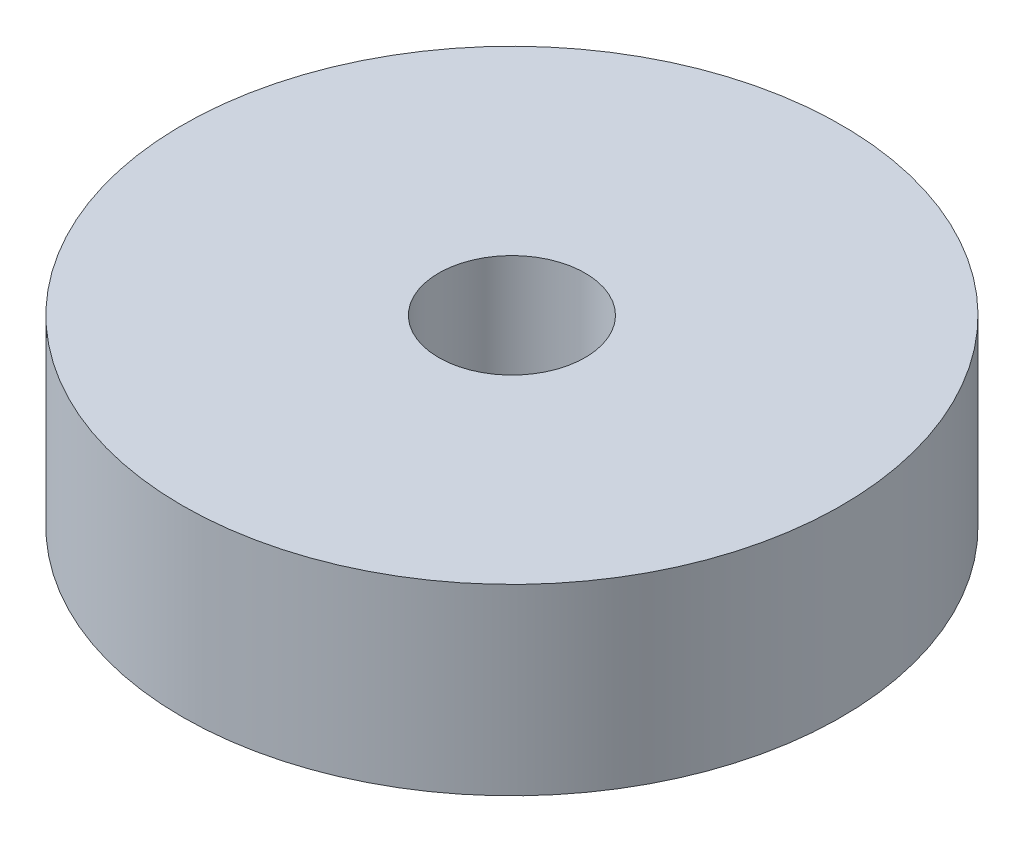
ISO-10303-21;
HEADER;
FILE_DESCRIPTION(('STEP AP214'),'2;1');
FILE_NAME('part.step','',(''),(''),'','','');
FILE_SCHEMA(('AUTOMOTIVE_DESIGN { 1 0 10303 214 1 1 1 1 }'));
ENDSEC;
DATA;
#1=APPLICATION_CONTEXT('core data for automotive mechanical design processes');
#2=APPLICATION_PROTOCOL_DEFINITION('international standard','automotive_design',2000,#1);
#3=PRODUCT_CONTEXT('',#1,'mechanical');
#4=PRODUCT('Part','Part','',(#3));
#5=PRODUCT_RELATED_PRODUCT_CATEGORY('part','',(#4));
#6=PRODUCT_DEFINITION_FORMATION('','',#4);
#7=PRODUCT_DEFINITION_CONTEXT('part definition',#1,'design');
#8=PRODUCT_DEFINITION('design','',#6,#7);
#9=PRODUCT_DEFINITION_SHAPE('','',#8);
#10=(LENGTH_UNIT() NAMED_UNIT(*) SI_UNIT(.MILLI.,.METRE.));
#11=(NAMED_UNIT(*) PLANE_ANGLE_UNIT() SI_UNIT($,.RADIAN.));
#12=(NAMED_UNIT(*) SI_UNIT($,.STERADIAN.) SOLID_ANGLE_UNIT());
#13=UNCERTAINTY_MEASURE_WITH_UNIT(LENGTH_MEASURE(1.E-05),#10,'distance_accuracy_value','');
#14=(GEOMETRIC_REPRESENTATION_CONTEXT(3) GLOBAL_UNCERTAINTY_ASSIGNED_CONTEXT((#13)) GLOBAL_UNIT_ASSIGNED_CONTEXT((#10,
#11,#12)) REPRESENTATION_CONTEXT('',''));
#15=CARTESIAN_POINT('',(0.,0.,0.));
#16=DIRECTION('',(0.,0.,1.));
#17=DIRECTION('',(1.,0.,0.));
#18=AXIS2_PLACEMENT_3D('',#15,#16,#17);
#19=CARTESIAN_POINT('',(0.,7.9375,0.));
#20=DIRECTION('',(0.,1.,0.));
#21=DIRECTION('',(0.,0.,1.));
#22=AXIS2_PLACEMENT_3D('',#19,#20,#21);
#23=PLANE('',#22);
#24=CARTESIAN_POINT('',(0.,7.9375,0.));
#25=DIRECTION('',(0.,1.,0.));
#26=DIRECTION('',(0.,0.,1.));
#27=AXIS2_PLACEMENT_3D('',#24,#25,#26);
#28=CIRCLE('',#27,14.2875);
#29=CARTESIAN_POINT('',(0.,7.9375,14.2875));
#30=VERTEX_POINT('',#29);
#31=EDGE_CURVE('E10',#30,#30,#28,.T.);
#32=ORIENTED_EDGE('',*,*,#31,.T.);
#33=EDGE_LOOP('',(#32));
#34=FACE_BOUND('',#33,.T.);
#35=CARTESIAN_POINT('',(0.,7.9375,0.));
#36=DIRECTION('',(0.,1.,0.));
#37=DIRECTION('',(0.,0.,1.));
#38=AXIS2_PLACEMENT_3D('',#35,#36,#37);
#39=CIRCLE('',#38,3.175);
#40=CARTESIAN_POINT('',(0.,7.9375,3.175));
#41=VERTEX_POINT('',#40);
#42=EDGE_CURVE('E49',#41,#41,#39,.T.);
#43=ORIENTED_EDGE('',*,*,#42,.F.);
#44=EDGE_LOOP('',(#43));
#45=FACE_BOUND('',#44,.T.);
#46=ADVANCED_FACE('F35',(#34,#45),#23,.T.);
#47=CARTESIAN_POINT('',(0.,0.,0.));
#48=DIRECTION('',(0.,1.,0.));
#49=DIRECTION('',(0.,0.,1.));
#50=AXIS2_PLACEMENT_3D('',#47,#48,#49);
#51=PLANE('',#50);
#52=CARTESIAN_POINT('',(0.,0.,0.));
#53=DIRECTION('',(0.,1.,0.));
#54=DIRECTION('',(0.,0.,1.));
#55=AXIS2_PLACEMENT_3D('',#52,#53,#54);
#56=CIRCLE('',#55,14.2875);
#57=CARTESIAN_POINT('',(0.,0.,14.2875));
#58=VERTEX_POINT('',#57);
#59=EDGE_CURVE('E39',#58,#58,#56,.T.);
#60=ORIENTED_EDGE('',*,*,#59,.F.);
#61=EDGE_LOOP('',(#60));
#62=FACE_BOUND('',#61,.T.);
#63=CARTESIAN_POINT('',(0.,0.,0.));
#64=DIRECTION('',(0.,1.,0.));
#65=DIRECTION('',(0.,0.,1.));
#66=AXIS2_PLACEMENT_3D('',#63,#64,#65);
#67=CIRCLE('',#66,3.175);
#68=CARTESIAN_POINT('',(0.,0.,3.175));
#69=VERTEX_POINT('',#68);
#70=EDGE_CURVE('E51',#69,#69,#67,.T.);
#71=ORIENTED_EDGE('',*,*,#70,.T.);
#72=EDGE_LOOP('',(#71));
#73=FACE_BOUND('',#72,.T.);
#74=ADVANCED_FACE('F62',(#62,#73),#51,.F.);
#75=CARTESIAN_POINT('',(0.,7.9375,0.));
#76=DIRECTION('',(0.,-1.,0.));
#77=DIRECTION('',(0.,0.,-1.));
#78=AXIS2_PLACEMENT_3D('',#75,#76,#77);
#79=CYLINDRICAL_SURFACE('',#78,14.2875);
#80=ORIENTED_EDGE('',*,*,#31,.F.);
#81=EDGE_LOOP('',(#80));
#82=FACE_BOUND('',#81,.T.);
#83=ORIENTED_EDGE('',*,*,#59,.T.);
#84=EDGE_LOOP('',(#83));
#85=FACE_BOUND('',#84,.T.);
#86=ADVANCED_FACE('F37',(#82,#85),#79,.T.);
#87=CARTESIAN_POINT('',(0.,7.9375,0.));
#88=DIRECTION('',(0.,-1.,0.));
#89=DIRECTION('',(0.,0.,-1.));
#90=AXIS2_PLACEMENT_3D('',#87,#88,#89);
#91=CYLINDRICAL_SURFACE('',#90,3.175);
#92=ORIENTED_EDGE('',*,*,#42,.T.);
#93=EDGE_LOOP('',(#92));
#94=FACE_BOUND('',#93,.T.);
#95=ORIENTED_EDGE('',*,*,#70,.F.);
#96=EDGE_LOOP('',(#95));
#97=FACE_BOUND('',#96,.T.);
#98=ADVANCED_FACE('F58',(#94,#97),#91,.F.);
#99=CLOSED_SHELL('',(#46,#74,#86,#98));
#100=MANIFOLD_SOLID_BREP('B2',#99);
#101=ADVANCED_BREP_SHAPE_REPRESENTATION('',(#18,#100),#14);
#102=SHAPE_DEFINITION_REPRESENTATION(#9,#101);
ENDSEC;
END-ISO-10303-21;
